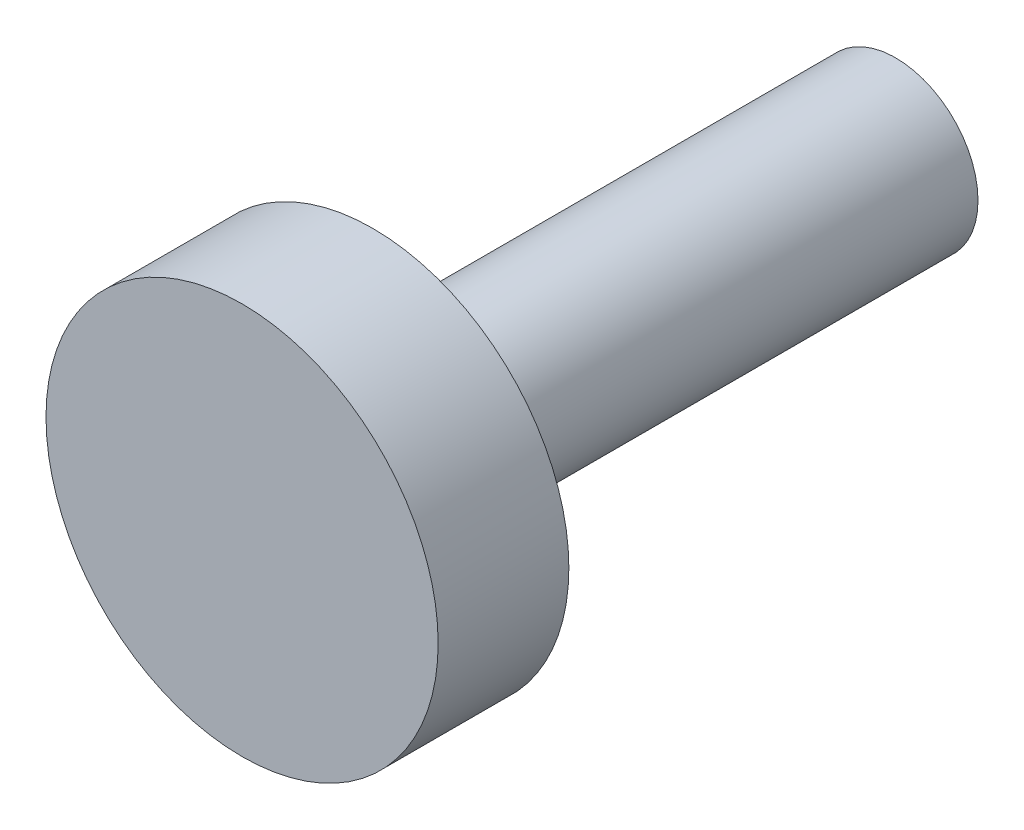
ISO-10303-21;
HEADER;
FILE_DESCRIPTION(('STEP AP214'),'2;1');
FILE_NAME('part.step','',(''),(''),'','','');
FILE_SCHEMA(('AUTOMOTIVE_DESIGN { 1 0 10303 214 1 1 1 1 }'));
ENDSEC;
DATA;
#1=APPLICATION_CONTEXT('core data for automotive mechanical design processes');
#2=APPLICATION_PROTOCOL_DEFINITION('international standard','automotive_design',2000,#1);
#3=PRODUCT_CONTEXT('',#1,'mechanical');
#4=PRODUCT('Part','Part','',(#3));
#5=PRODUCT_RELATED_PRODUCT_CATEGORY('part','',(#4));
#6=PRODUCT_DEFINITION_FORMATION('','',#4);
#7=PRODUCT_DEFINITION_CONTEXT('part definition',#1,'design');
#8=PRODUCT_DEFINITION('design','',#6,#7);
#9=PRODUCT_DEFINITION_SHAPE('','',#8);
#10=(LENGTH_UNIT() NAMED_UNIT(*) SI_UNIT(.MILLI.,.METRE.));
#11=(NAMED_UNIT(*) PLANE_ANGLE_UNIT() SI_UNIT($,.RADIAN.));
#12=(NAMED_UNIT(*) SI_UNIT($,.STERADIAN.) SOLID_ANGLE_UNIT());
#13=UNCERTAINTY_MEASURE_WITH_UNIT(LENGTH_MEASURE(1.E-05),#10,'distance_accuracy_value','');
#14=(GEOMETRIC_REPRESENTATION_CONTEXT(3) GLOBAL_UNCERTAINTY_ASSIGNED_CONTEXT((#13)) GLOBAL_UNIT_ASSIGNED_CONTEXT((#10,
#11,#12)) REPRESENTATION_CONTEXT('',''));
#15=CARTESIAN_POINT('',(0.,0.,0.));
#16=DIRECTION('',(0.,0.,1.));
#17=DIRECTION('',(1.,0.,0.));
#18=AXIS2_PLACEMENT_3D('',#15,#16,#17);
#19=CARTESIAN_POINT('',(0.,0.,6.35));
#20=DIRECTION('',(0.,0.,-1.));
#21=DIRECTION('',(-1.,0.,0.));
#22=AXIS2_PLACEMENT_3D('',#19,#20,#21);
#23=CYLINDRICAL_SURFACE('',#22,9.525);
#24=CARTESIAN_POINT('',(0.,0.,6.35));
#25=DIRECTION('',(0.,0.,1.));
#26=DIRECTION('',(1.,0.,0.));
#27=AXIS2_PLACEMENT_3D('',#24,#25,#26);
#28=CIRCLE('',#27,9.525);
#29=CARTESIAN_POINT('',(9.525,0.,6.35));
#30=VERTEX_POINT('',#29);
#31=EDGE_CURVE('E10',#30,#30,#28,.T.);
#32=ORIENTED_EDGE('',*,*,#31,.F.);
#33=EDGE_LOOP('',(#32));
#34=FACE_BOUND('',#33,.T.);
#35=CARTESIAN_POINT('',(0.,0.,0.));
#36=DIRECTION('',(0.,0.,1.));
#37=DIRECTION('',(1.,0.,0.));
#38=AXIS2_PLACEMENT_3D('',#35,#36,#37);
#39=CIRCLE('',#38,9.525);
#40=CARTESIAN_POINT('',(9.525,0.,0.));
#41=VERTEX_POINT('',#40);
#42=EDGE_CURVE('E43',#41,#41,#39,.T.);
#43=ORIENTED_EDGE('',*,*,#42,.T.);
#44=EDGE_LOOP('',(#43));
#45=FACE_BOUND('',#44,.T.);
#46=ADVANCED_FACE('F40',(#34,#45),#23,.T.);
#47=CARTESIAN_POINT('',(0.,0.,6.35));
#48=DIRECTION('',(0.,0.,1.));
#49=DIRECTION('',(1.,0.,0.));
#50=AXIS2_PLACEMENT_3D('',#47,#48,#49);
#51=PLANE('',#50);
#52=ORIENTED_EDGE('',*,*,#31,.T.);
#53=EDGE_LOOP('',(#52));
#54=FACE_BOUND('',#53,.T.);
#55=ADVANCED_FACE('F76',(#54),#51,.T.);
#56=CARTESIAN_POINT('',(0.,0.,0.));
#57=DIRECTION('',(0.,0.,1.));
#58=DIRECTION('',(1.,0.,0.));
#59=AXIS2_PLACEMENT_3D('',#56,#57,#58);
#60=PLANE('',#59);
#61=CARTESIAN_POINT('',(0.,0.,0.));
#62=DIRECTION('',(0.,0.,1.));
#63=DIRECTION('',(1.,0.,0.));
#64=AXIS2_PLACEMENT_3D('',#61,#62,#63);
#65=CIRCLE('',#64,4.);
#66=CARTESIAN_POINT('',(4.,0.,0.));
#67=VERTEX_POINT('',#66);
#68=EDGE_CURVE('E55',#67,#67,#65,.T.);
#69=ORIENTED_EDGE('',*,*,#68,.T.);
#70=EDGE_LOOP('',(#69));
#71=FACE_BOUND('',#70,.T.);
#72=ORIENTED_EDGE('',*,*,#42,.F.);
#73=EDGE_LOOP('',(#72));
#74=FACE_BOUND('',#73,.T.);
#75=ADVANCED_FACE('F73',(#71,#74),#60,.F.);
#76=CARTESIAN_POINT('',(0.,0.,-25.4));
#77=DIRECTION('',(0.,0.,1.));
#78=DIRECTION('',(1.,0.,0.));
#79=AXIS2_PLACEMENT_3D('',#76,#77,#78);
#80=CYLINDRICAL_SURFACE('',#79,4.);
#81=CARTESIAN_POINT('',(0.,0.,-25.4));
#82=DIRECTION('',(0.,0.,1.));
#83=DIRECTION('',(1.,0.,0.));
#84=AXIS2_PLACEMENT_3D('',#81,#82,#83);
#85=CIRCLE('',#84,4.);
#86=CARTESIAN_POINT('',(4.,0.,-25.4));
#87=VERTEX_POINT('',#86);
#88=EDGE_CURVE('E53',#87,#87,#85,.T.);
#89=ORIENTED_EDGE('',*,*,#88,.T.);
#90=EDGE_LOOP('',(#89));
#91=FACE_BOUND('',#90,.T.);
#92=ORIENTED_EDGE('',*,*,#68,.F.);
#93=EDGE_LOOP('',(#92));
#94=FACE_BOUND('',#93,.T.);
#95=ADVANCED_FACE('F64',(#91,#94),#80,.T.);
#96=CARTESIAN_POINT('',(0.,0.,-25.4));
#97=DIRECTION('',(0.,0.,1.));
#98=DIRECTION('',(1.,0.,0.));
#99=AXIS2_PLACEMENT_3D('',#96,#97,#98);
#100=PLANE('',#99);
#101=ORIENTED_EDGE('',*,*,#88,.F.);
#102=EDGE_LOOP('',(#101));
#103=FACE_BOUND('',#102,.T.);
#104=ADVANCED_FACE('F67',(#103),#100,.F.);
#105=CLOSED_SHELL('',(#46,#55,#75,#95,#104));
#106=MANIFOLD_SOLID_BREP('B2',#105);
#107=ADVANCED_BREP_SHAPE_REPRESENTATION('',(#18,#106),#14);
#108=SHAPE_DEFINITION_REPRESENTATION(#9,#107);
ENDSEC;
END-ISO-10303-21;
